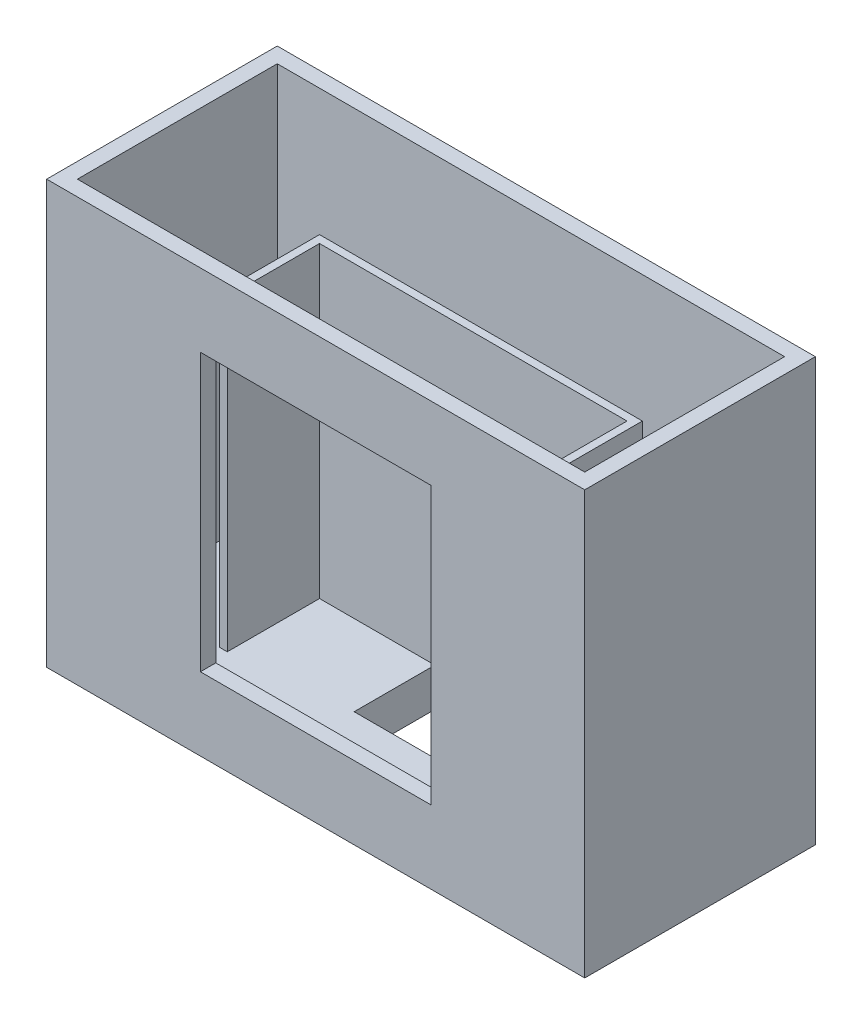
ISO-10303-21;
HEADER;
FILE_DESCRIPTION(('STEP AP214'),'2;1');
FILE_NAME('part.step','',(''),(''),'','','');
FILE_SCHEMA(('AUTOMOTIVE_DESIGN { 1 0 10303 214 1 1 1 1 }'));
ENDSEC;
DATA;
#1=APPLICATION_CONTEXT('core data for automotive mechanical design processes');
#2=APPLICATION_PROTOCOL_DEFINITION('international standard','automotive_design',2000,#1);
#3=PRODUCT_CONTEXT('',#1,'mechanical');
#4=PRODUCT('Part','Part','',(#3));
#5=PRODUCT_RELATED_PRODUCT_CATEGORY('part','',(#4));
#6=PRODUCT_DEFINITION_FORMATION('','',#4);
#7=PRODUCT_DEFINITION_CONTEXT('part definition',#1,'design');
#8=PRODUCT_DEFINITION('design','',#6,#7);
#9=PRODUCT_DEFINITION_SHAPE('','',#8);
#10=(LENGTH_UNIT() NAMED_UNIT(*) SI_UNIT(.MILLI.,.METRE.));
#11=(NAMED_UNIT(*) PLANE_ANGLE_UNIT() SI_UNIT($,.RADIAN.));
#12=(NAMED_UNIT(*) SI_UNIT($,.STERADIAN.) SOLID_ANGLE_UNIT());
#13=UNCERTAINTY_MEASURE_WITH_UNIT(LENGTH_MEASURE(1.E-05),#10,'distance_accuracy_value','');
#14=(GEOMETRIC_REPRESENTATION_CONTEXT(3) GLOBAL_UNCERTAINTY_ASSIGNED_CONTEXT((#13)) GLOBAL_UNIT_ASSIGNED_CONTEXT((#10,
#11,#12)) REPRESENTATION_CONTEXT('',''));
#15=CARTESIAN_POINT('',(0.,0.,0.));
#16=DIRECTION('',(0.,0.,1.));
#17=DIRECTION('',(1.,0.,0.));
#18=AXIS2_PLACEMENT_3D('',#15,#16,#17);
#19=CARTESIAN_POINT('',(0.,5.,0.));
#20=DIRECTION('',(0.,1.,0.));
#21=DIRECTION('',(0.,0.,1.));
#22=AXIS2_PLACEMENT_3D('',#19,#20,#21);
#23=PLANE('',#22);
#24=DIRECTION('',(0.,0.,-1.));
#25=VECTOR('',#24,1.);
#26=CARTESIAN_POINT('',(20.,5.,5.50000000000001));
#27=LINE('',#26,#25);
#28=CARTESIAN_POINT('',(20.,5.,6.5));
#29=VERTEX_POINT('',#28);
#30=CARTESIAN_POINT('',(20.,5.,-5.5));
#31=VERTEX_POINT('',#30);
#32=EDGE_CURVE('E274',#29,#31,#27,.T.);
#33=ORIENTED_EDGE('',*,*,#32,.T.);
#34=DIRECTION('',(-1.,0.,0.));
#35=VECTOR('',#34,1.);
#36=CARTESIAN_POINT('',(-20.,5.,-5.5));
#37=LINE('',#36,#35);
#38=CARTESIAN_POINT('',(-20.,5.,-5.5));
#39=VERTEX_POINT('',#38);
#40=EDGE_CURVE('E284',#31,#39,#37,.T.);
#41=ORIENTED_EDGE('',*,*,#40,.T.);
#42=DIRECTION('',(0.,0.,1.));
#43=VECTOR('',#42,1.);
#44=CARTESIAN_POINT('',(-20.,5.,5.50000000000001));
#45=LINE('',#44,#43);
#46=CARTESIAN_POINT('',(-20.,5.,6.5));
#47=VERTEX_POINT('',#46);
#48=EDGE_CURVE('E278',#39,#47,#45,.T.);
#49=ORIENTED_EDGE('',*,*,#48,.T.);
#50=DIRECTION('',(1.,0.,0.));
#51=VECTOR('',#50,1.);
#52=CARTESIAN_POINT('',(-21.,5.,6.5));
#53=LINE('',#52,#51);
#54=CARTESIAN_POINT('',(-21.,5.,6.5));
#55=VERTEX_POINT('',#54);
#56=EDGE_CURVE('E297',#55,#47,#53,.T.);
#57=ORIENTED_EDGE('',*,*,#56,.F.);
#58=DIRECTION('',(0.,0.,1.));
#59=VECTOR('',#58,1.);
#60=CARTESIAN_POINT('',(-21.,5.,6.5));
#61=LINE('',#60,#59);
#62=CARTESIAN_POINT('',(-21.,5.,-6.5));
#63=VERTEX_POINT('',#62);
#64=EDGE_CURVE('E310',#63,#55,#61,.T.);
#65=ORIENTED_EDGE('',*,*,#64,.F.);
#66=DIRECTION('',(-1.,0.,0.));
#67=VECTOR('',#66,1.);
#68=CARTESIAN_POINT('',(-21.,5.,-6.5));
#69=LINE('',#68,#67);
#70=CARTESIAN_POINT('',(21.,5.,-6.5));
#71=VERTEX_POINT('',#70);
#72=EDGE_CURVE('E308',#71,#63,#69,.T.);
#73=ORIENTED_EDGE('',*,*,#72,.F.);
#74=DIRECTION('',(0.,0.,-1.));
#75=VECTOR('',#74,1.);
#76=CARTESIAN_POINT('',(21.,5.,6.5));
#77=LINE('',#76,#75);
#78=CARTESIAN_POINT('',(21.,5.,6.5));
#79=VERTEX_POINT('',#78);
#80=EDGE_CURVE('E292',#79,#71,#77,.T.);
#81=ORIENTED_EDGE('',*,*,#80,.F.);
#82=EDGE_CURVE('E313',#29,#79,#53,.T.);
#83=ORIENTED_EDGE('',*,*,#82,.F.);
#84=EDGE_LOOP('',(#33,#41,#49,#57,#65,#73,#81,#83));
#85=FACE_BOUND('',#84,.T.);
#86=DIRECTION('',(-1.,0.,0.));
#87=VECTOR('',#86,1.);
#88=CARTESIAN_POINT('',(-35.,5.,13.));
#89=LINE('',#88,#87);
#90=CARTESIAN_POINT('',(33.,5.,13.));
#91=VERTEX_POINT('',#90);
#92=CARTESIAN_POINT('',(-33.,5.,13.));
#93=VERTEX_POINT('',#92);
#94=EDGE_CURVE('E350',#91,#93,#89,.T.);
#95=ORIENTED_EDGE('',*,*,#94,.F.);
#96=DIRECTION('',(0.,0.,1.));
#97=VECTOR('',#96,1.);
#98=CARTESIAN_POINT('',(33.,5.,-13.));
#99=LINE('',#98,#97);
#100=CARTESIAN_POINT('',(33.,5.,-13.));
#101=VERTEX_POINT('',#100);
#102=EDGE_CURVE('E331',#101,#91,#99,.T.);
#103=ORIENTED_EDGE('',*,*,#102,.F.);
#104=DIRECTION('',(1.,0.,0.));
#105=VECTOR('',#104,1.);
#106=CARTESIAN_POINT('',(-35.,5.,-13.));
#107=LINE('',#106,#105);
#108=CARTESIAN_POINT('',(-33.,5.,-13.));
#109=VERTEX_POINT('',#108);
#110=EDGE_CURVE('E347',#109,#101,#107,.T.);
#111=ORIENTED_EDGE('',*,*,#110,.F.);
#112=DIRECTION('',(0.,0.,-1.));
#113=VECTOR('',#112,1.);
#114=CARTESIAN_POINT('',(-33.,5.,-13.));
#115=LINE('',#114,#113);
#116=EDGE_CURVE('E333',#93,#109,#115,.T.);
#117=ORIENTED_EDGE('',*,*,#116,.F.);
#118=EDGE_LOOP('',(#95,#103,#111,#117));
#119=FACE_BOUND('',#118,.T.);
#120=DIRECTION('',(1.,0.,0.));
#121=VECTOR('',#120,1.);
#122=CARTESIAN_POINT('',(-5.,5.,-5.));
#123=LINE('',#122,#121);
#124=CARTESIAN_POINT('',(-5.,5.,-5.));
#125=VERTEX_POINT('',#124);
#126=CARTESIAN_POINT('',(5.,5.,-5.));
#127=VERTEX_POINT('',#126);
#128=EDGE_CURVE('E211',#125,#127,#123,.T.);
#129=ORIENTED_EDGE('',*,*,#128,.T.);
#130=DIRECTION('',(0.,0.,1.));
#131=VECTOR('',#130,1.);
#132=CARTESIAN_POINT('',(5.,5.,-5.));
#133=LINE('',#132,#131);
#134=CARTESIAN_POINT('',(5.,5.,5.));
#135=VERTEX_POINT('',#134);
#136=EDGE_CURVE('E205',#127,#135,#133,.T.);
#137=ORIENTED_EDGE('',*,*,#136,.T.);
#138=DIRECTION('',(-1.,0.,0.));
#139=VECTOR('',#138,1.);
#140=CARTESIAN_POINT('',(-5.,5.,5.));
#141=LINE('',#140,#139);
#142=CARTESIAN_POINT('',(-5.,5.,5.));
#143=VERTEX_POINT('',#142);
#144=EDGE_CURVE('E214',#135,#143,#141,.T.);
#145=ORIENTED_EDGE('',*,*,#144,.T.);
#146=DIRECTION('',(0.,0.,-1.));
#147=VECTOR('',#146,1.);
#148=CARTESIAN_POINT('',(-5.,5.,-5.));
#149=LINE('',#148,#147);
#150=EDGE_CURVE('E57',#143,#125,#149,.T.);
#151=ORIENTED_EDGE('',*,*,#150,.T.);
#152=EDGE_LOOP('',(#129,#137,#145,#151));
#153=FACE_BOUND('',#152,.T.);
#154=ADVANCED_FACE('F42',(#85,#119,#153),#23,.T.);
#155=CARTESIAN_POINT('',(-35.,55.,13.));
#156=DIRECTION('',(0.,0.,1.));
#157=DIRECTION('',(1.,0.,0.));
#158=AXIS2_PLACEMENT_3D('',#155,#156,#157);
#159=PLANE('',#158);
#160=DIRECTION('',(0.,-1.,0.));
#161=VECTOR('',#160,1.);
#162=CARTESIAN_POINT('',(33.,55.,13.));
#163=LINE('',#162,#161);
#164=CARTESIAN_POINT('',(33.,55.,13.));
#165=VERTEX_POINT('',#164);
#166=EDGE_CURVE('E327',#165,#91,#163,.T.);
#167=ORIENTED_EDGE('',*,*,#166,.T.);
#168=ORIENTED_EDGE('',*,*,#94,.T.);
#169=DIRECTION('',(0.,-1.,0.));
#170=VECTOR('',#169,1.);
#171=CARTESIAN_POINT('',(-33.,55.,13.));
#172=LINE('',#171,#170);
#173=CARTESIAN_POINT('',(-33.,55.,13.));
#174=VERTEX_POINT('',#173);
#175=EDGE_CURVE('E343',#174,#93,#172,.T.);
#176=ORIENTED_EDGE('',*,*,#175,.F.);
#177=DIRECTION('',(-1.,0.,0.));
#178=VECTOR('',#177,1.);
#179=CARTESIAN_POINT('',(-35.,55.,13.));
#180=LINE('',#179,#178);
#181=EDGE_CURVE('E364',#165,#174,#180,.T.);
#182=ORIENTED_EDGE('',*,*,#181,.F.);
#183=EDGE_LOOP('',(#167,#168,#176,#182));
#184=FACE_BOUND('',#183,.T.);
#185=DIRECTION('',(1.,0.,0.));
#186=VECTOR('',#185,1.);
#187=CARTESIAN_POINT('',(-35.,45.5,13.));
#188=LINE('',#187,#186);
#189=CARTESIAN_POINT('',(-15.,45.5,13.));
#190=VERTEX_POINT('',#189);
#191=CARTESIAN_POINT('',(15.,45.5,13.));
#192=VERTEX_POINT('',#191);
#193=EDGE_CURVE('E266',#190,#192,#188,.T.);
#194=ORIENTED_EDGE('',*,*,#193,.F.);
#195=DIRECTION('',(0.,1.,0.));
#196=VECTOR('',#195,1.);
#197=CARTESIAN_POINT('',(-15.,55.,13.));
#198=LINE('',#197,#196);
#199=CARTESIAN_POINT('',(-15.,9.50000000000001,13.));
#200=VERTEX_POINT('',#199);
#201=EDGE_CURVE('E252',#200,#190,#198,.T.);
#202=ORIENTED_EDGE('',*,*,#201,.F.);
#203=DIRECTION('',(1.,0.,0.));
#204=VECTOR('',#203,1.);
#205=CARTESIAN_POINT('',(-35.,9.5,13.));
#206=LINE('',#205,#204);
#207=CARTESIAN_POINT('',(15.,9.50000000000001,13.));
#208=VERTEX_POINT('',#207);
#209=EDGE_CURVE('E260',#200,#208,#206,.T.);
#210=ORIENTED_EDGE('',*,*,#209,.T.);
#211=DIRECTION('',(0.,1.,0.));
#212=VECTOR('',#211,1.);
#213=CARTESIAN_POINT('',(15.,55.,13.));
#214=LINE('',#213,#212);
#215=EDGE_CURVE('E263',#208,#192,#214,.T.);
#216=ORIENTED_EDGE('',*,*,#215,.T.);
#217=EDGE_LOOP('',(#194,#202,#210,#216));
#218=FACE_BOUND('',#217,.T.);
#219=ADVANCED_FACE('F411',(#184,#218),#159,.F.);
#220=CARTESIAN_POINT('',(-35.,5.,15.));
#221=DIRECTION('',(0.,0.,-1.));
#222=DIRECTION('',(-1.,0.,0.));
#223=AXIS2_PLACEMENT_3D('',#220,#221,#222);
#224=PLANE('',#223);
#225=DIRECTION('',(1.,0.,0.));
#226=VECTOR('',#225,1.);
#227=CARTESIAN_POINT('',(-35.,0.,15.));
#228=LINE('',#227,#226);
#229=CARTESIAN_POINT('',(-35.,0.,15.));
#230=VERTEX_POINT('',#229);
#231=CARTESIAN_POINT('',(35.,0.,15.));
#232=VERTEX_POINT('',#231);
#233=EDGE_CURVE('E374',#230,#232,#228,.T.);
#234=ORIENTED_EDGE('',*,*,#233,.T.);
#235=DIRECTION('',(0.,-1.,0.));
#236=VECTOR('',#235,1.);
#237=CARTESIAN_POINT('',(35.,5.,15.));
#238=LINE('',#237,#236);
#239=CARTESIAN_POINT('',(35.,55.,15.));
#240=VERTEX_POINT('',#239);
#241=EDGE_CURVE('E376',#240,#232,#238,.T.);
#242=ORIENTED_EDGE('',*,*,#241,.F.);
#243=DIRECTION('',(1.,0.,0.));
#244=VECTOR('',#243,1.);
#245=CARTESIAN_POINT('',(-35.,55.,15.));
#246=LINE('',#245,#244);
#247=CARTESIAN_POINT('',(-35.,55.,15.));
#248=VERTEX_POINT('',#247);
#249=EDGE_CURVE('E359',#248,#240,#246,.T.);
#250=ORIENTED_EDGE('',*,*,#249,.F.);
#251=DIRECTION('',(0.,-1.,0.));
#252=VECTOR('',#251,1.);
#253=CARTESIAN_POINT('',(-35.,5.,15.));
#254=LINE('',#253,#252);
#255=EDGE_CURVE('E379',#248,#230,#254,.T.);
#256=ORIENTED_EDGE('',*,*,#255,.T.);
#257=EDGE_LOOP('',(#234,#242,#250,#256));
#258=FACE_BOUND('',#257,.T.);
#259=DIRECTION('',(1.,0.,0.));
#260=VECTOR('',#259,1.);
#261=CARTESIAN_POINT('',(0.,45.5,15.));
#262=LINE('',#261,#260);
#263=CARTESIAN_POINT('',(-15.,45.5,15.));
#264=VERTEX_POINT('',#263);
#265=CARTESIAN_POINT('',(15.,45.5,15.));
#266=VERTEX_POINT('',#265);
#267=EDGE_CURVE('E234',#264,#266,#262,.T.);
#268=ORIENTED_EDGE('',*,*,#267,.T.);
#269=DIRECTION('',(0.,1.,0.));
#270=VECTOR('',#269,1.);
#271=CARTESIAN_POINT('',(15.,0.,15.));
#272=LINE('',#271,#270);
#273=CARTESIAN_POINT('',(15.,9.50000000000001,15.));
#274=VERTEX_POINT('',#273);
#275=EDGE_CURVE('E246',#274,#266,#272,.T.);
#276=ORIENTED_EDGE('',*,*,#275,.F.);
#277=DIRECTION('',(1.,0.,0.));
#278=VECTOR('',#277,1.);
#279=CARTESIAN_POINT('',(0.,9.50000000000001,15.));
#280=LINE('',#279,#278);
#281=CARTESIAN_POINT('',(-15.,9.50000000000001,15.));
#282=VERTEX_POINT('',#281);
#283=EDGE_CURVE('E243',#282,#274,#280,.T.);
#284=ORIENTED_EDGE('',*,*,#283,.F.);
#285=DIRECTION('',(0.,1.,0.));
#286=VECTOR('',#285,1.);
#287=CARTESIAN_POINT('',(-15.,0.,15.));
#288=LINE('',#287,#286);
#289=EDGE_CURVE('E240',#282,#264,#288,.T.);
#290=ORIENTED_EDGE('',*,*,#289,.T.);
#291=EDGE_LOOP('',(#268,#276,#284,#290));
#292=FACE_BOUND('',#291,.T.);
#293=ADVANCED_FACE('F393',(#258,#292),#224,.F.);
#294=CARTESIAN_POINT('',(-21.,45.,6.5));
#295=DIRECTION('',(0.,0.,-1.));
#296=DIRECTION('',(-1.,0.,0.));
#297=AXIS2_PLACEMENT_3D('',#294,#295,#296);
#298=PLANE('',#297);
#299=ORIENTED_EDGE('',*,*,#56,.T.);
#300=DIRECTION('',(0.,-1.,0.));
#301=VECTOR('',#300,1.);
#302=CARTESIAN_POINT('',(-20.,45.,6.5));
#303=LINE('',#302,#301);
#304=CARTESIAN_POINT('',(-20.,45.,6.5));
#305=VERTEX_POINT('',#304);
#306=EDGE_CURVE('E268',#305,#47,#303,.T.);
#307=ORIENTED_EDGE('',*,*,#306,.F.);
#308=DIRECTION('',(1.,0.,0.));
#309=VECTOR('',#308,1.);
#310=CARTESIAN_POINT('',(-21.,45.,6.5));
#311=LINE('',#310,#309);
#312=CARTESIAN_POINT('',(-21.,45.,6.5));
#313=VERTEX_POINT('',#312);
#314=EDGE_CURVE('E302',#313,#305,#311,.T.);
#315=ORIENTED_EDGE('',*,*,#314,.F.);
#316=DIRECTION('',(0.,-1.,0.));
#317=VECTOR('',#316,1.);
#318=CARTESIAN_POINT('',(-21.,45.,6.5));
#319=LINE('',#318,#317);
#320=EDGE_CURVE('E318',#313,#55,#319,.T.);
#321=ORIENTED_EDGE('',*,*,#320,.T.);
#322=EDGE_LOOP('',(#299,#307,#315,#321));
#323=FACE_BOUND('',#322,.T.);
#324=ADVANCED_FACE('F427',(#323),#298,.F.);
#325=CARTESIAN_POINT('',(-35.,55.,-13.));
#326=DIRECTION('',(0.,0.,-1.));
#327=DIRECTION('',(-1.,0.,0.));
#328=AXIS2_PLACEMENT_3D('',#325,#326,#327);
#329=PLANE('',#328);
#330=DIRECTION('',(0.,-1.,0.));
#331=VECTOR('',#330,1.);
#332=CARTESIAN_POINT('',(33.,55.,-13.));
#333=LINE('',#332,#331);
#334=CARTESIAN_POINT('',(33.,55.,-13.));
#335=VERTEX_POINT('',#334);
#336=EDGE_CURVE('E325',#335,#101,#333,.T.);
#337=ORIENTED_EDGE('',*,*,#336,.F.);
#338=DIRECTION('',(1.,0.,0.));
#339=VECTOR('',#338,1.);
#340=CARTESIAN_POINT('',(-35.,55.,-13.));
#341=LINE('',#340,#339);
#342=CARTESIAN_POINT('',(-33.,55.,-13.));
#343=VERTEX_POINT('',#342);
#344=EDGE_CURVE('E351',#343,#335,#341,.T.);
#345=ORIENTED_EDGE('',*,*,#344,.F.);
#346=DIRECTION('',(0.,-1.,0.));
#347=VECTOR('',#346,1.);
#348=CARTESIAN_POINT('',(-33.,55.,-13.));
#349=LINE('',#348,#347);
#350=EDGE_CURVE('E339',#343,#109,#349,.T.);
#351=ORIENTED_EDGE('',*,*,#350,.T.);
#352=ORIENTED_EDGE('',*,*,#110,.T.);
#353=EDGE_LOOP('',(#337,#345,#351,#352));
#354=FACE_BOUND('',#353,.T.);
#355=ADVANCED_FACE('F409',(#354),#329,.F.);
#356=CARTESIAN_POINT('',(35.,5.,-15.));
#357=DIRECTION('',(-1.,0.,0.));
#358=DIRECTION('',(0.,0.,1.));
#359=AXIS2_PLACEMENT_3D('',#356,#357,#358);
#360=PLANE('',#359);
#361=DIRECTION('',(0.,0.,-1.));
#362=VECTOR('',#361,1.);
#363=CARTESIAN_POINT('',(35.,0.,-15.));
#364=LINE('',#363,#362);
#365=CARTESIAN_POINT('',(35.,0.,-15.));
#366=VERTEX_POINT('',#365);
#367=EDGE_CURVE('E366',#232,#366,#364,.T.);
#368=ORIENTED_EDGE('',*,*,#367,.T.);
#369=DIRECTION('',(0.,-1.,0.));
#370=VECTOR('',#369,1.);
#371=CARTESIAN_POINT('',(35.,5.,-15.));
#372=LINE('',#371,#370);
#373=CARTESIAN_POINT('',(35.,55.,-15.));
#374=VERTEX_POINT('',#373);
#375=EDGE_CURVE('E11',#374,#366,#372,.T.);
#376=ORIENTED_EDGE('',*,*,#375,.F.);
#377=DIRECTION('',(0.,0.,-1.));
#378=VECTOR('',#377,1.);
#379=CARTESIAN_POINT('',(35.,55.,15.));
#380=LINE('',#379,#378);
#381=EDGE_CURVE('E362',#240,#374,#380,.T.);
#382=ORIENTED_EDGE('',*,*,#381,.F.);
#383=ORIENTED_EDGE('',*,*,#241,.T.);
#384=EDGE_LOOP('',(#368,#376,#382,#383));
#385=FACE_BOUND('',#384,.T.);
#386=ADVANCED_FACE('F44',(#385),#360,.F.);
#387=CARTESIAN_POINT('',(-35.,5.,-15.));
#388=DIRECTION('',(0.,0.,1.));
#389=DIRECTION('',(1.,0.,0.));
#390=AXIS2_PLACEMENT_3D('',#387,#388,#389);
#391=PLANE('',#390);
#392=DIRECTION('',(-1.,0.,0.));
#393=VECTOR('',#392,1.);
#394=CARTESIAN_POINT('',(-35.,0.,-15.));
#395=LINE('',#394,#393);
#396=CARTESIAN_POINT('',(-35.,0.,-15.));
#397=VERTEX_POINT('',#396);
#398=EDGE_CURVE('E370',#366,#397,#395,.T.);
#399=ORIENTED_EDGE('',*,*,#398,.T.);
#400=DIRECTION('',(0.,-1.,0.));
#401=VECTOR('',#400,1.);
#402=CARTESIAN_POINT('',(-35.,5.,-15.));
#403=LINE('',#402,#401);
#404=CARTESIAN_POINT('',(-35.,55.,-15.));
#405=VERTEX_POINT('',#404);
#406=EDGE_CURVE('E50',#405,#397,#403,.T.);
#407=ORIENTED_EDGE('',*,*,#406,.F.);
#408=DIRECTION('',(-1.,0.,0.));
#409=VECTOR('',#408,1.);
#410=CARTESIAN_POINT('',(-35.,55.,-15.));
#411=LINE('',#410,#409);
#412=EDGE_CURVE('E346',#374,#405,#411,.T.);
#413=ORIENTED_EDGE('',*,*,#412,.F.);
#414=ORIENTED_EDGE('',*,*,#375,.T.);
#415=EDGE_LOOP('',(#399,#407,#413,#414));
#416=FACE_BOUND('',#415,.T.);
#417=ADVANCED_FACE('F401',(#416),#391,.F.);
#418=CARTESIAN_POINT('',(-35.,5.,-15.));
#419=DIRECTION('',(1.,0.,0.));
#420=DIRECTION('',(0.,0.,-1.));
#421=AXIS2_PLACEMENT_3D('',#418,#419,#420);
#422=PLANE('',#421);
#423=DIRECTION('',(0.,0.,1.));
#424=VECTOR('',#423,1.);
#425=CARTESIAN_POINT('',(-35.,0.,-15.));
#426=LINE('',#425,#424);
#427=EDGE_CURVE('E372',#397,#230,#426,.T.);
#428=ORIENTED_EDGE('',*,*,#427,.T.);
#429=ORIENTED_EDGE('',*,*,#255,.F.);
#430=DIRECTION('',(0.,0.,1.));
#431=VECTOR('',#430,1.);
#432=CARTESIAN_POINT('',(-35.,55.,15.));
#433=LINE('',#432,#431);
#434=EDGE_CURVE('E356',#405,#248,#433,.T.);
#435=ORIENTED_EDGE('',*,*,#434,.F.);
#436=ORIENTED_EDGE('',*,*,#406,.T.);
#437=EDGE_LOOP('',(#428,#429,#435,#436));
#438=FACE_BOUND('',#437,.T.);
#439=ADVANCED_FACE('F385',(#438),#422,.F.);
#440=CARTESIAN_POINT('',(0.,0.,0.));
#441=DIRECTION('',(0.,1.,0.));
#442=DIRECTION('',(0.,0.,1.));
#443=AXIS2_PLACEMENT_3D('',#440,#441,#442);
#444=PLANE('',#443);
#445=DIRECTION('',(-1.,0.,0.));
#446=VECTOR('',#445,1.);
#447=CARTESIAN_POINT('',(-5.,0.,5.));
#448=LINE('',#447,#446);
#449=CARTESIAN_POINT('',(5.,0.,5.));
#450=VERTEX_POINT('',#449);
#451=CARTESIAN_POINT('',(-5.,0.,5.));
#452=VERTEX_POINT('',#451);
#453=EDGE_CURVE('E228',#450,#452,#448,.T.);
#454=ORIENTED_EDGE('',*,*,#453,.F.);
#455=DIRECTION('',(0.,0.,1.));
#456=VECTOR('',#455,1.);
#457=CARTESIAN_POINT('',(5.,0.,-5.));
#458=LINE('',#457,#456);
#459=CARTESIAN_POINT('',(5.,0.,-5.));
#460=VERTEX_POINT('',#459);
#461=EDGE_CURVE('E65',#460,#450,#458,.T.);
#462=ORIENTED_EDGE('',*,*,#461,.F.);
#463=DIRECTION('',(1.,0.,0.));
#464=VECTOR('',#463,1.);
#465=CARTESIAN_POINT('',(-5.,0.,-5.));
#466=LINE('',#465,#464);
#467=CARTESIAN_POINT('',(-5.,0.,-5.));
#468=VERTEX_POINT('',#467);
#469=EDGE_CURVE('E219',#468,#460,#466,.T.);
#470=ORIENTED_EDGE('',*,*,#469,.F.);
#471=DIRECTION('',(0.,0.,-1.));
#472=VECTOR('',#471,1.);
#473=CARTESIAN_POINT('',(-5.,0.,-5.));
#474=LINE('',#473,#472);
#475=EDGE_CURVE('E222',#452,#468,#474,.T.);
#476=ORIENTED_EDGE('',*,*,#475,.F.);
#477=EDGE_LOOP('',(#454,#462,#470,#476));
#478=FACE_BOUND('',#477,.T.);
#479=ORIENTED_EDGE('',*,*,#367,.F.);
#480=ORIENTED_EDGE('',*,*,#233,.F.);
#481=ORIENTED_EDGE('',*,*,#427,.F.);
#482=ORIENTED_EDGE('',*,*,#398,.F.);
#483=EDGE_LOOP('',(#479,#480,#481,#482));
#484=FACE_BOUND('',#483,.T.);
#485=ADVANCED_FACE('F391',(#478,#484),#444,.F.);
#486=CARTESIAN_POINT('',(0.,55.,0.));
#487=DIRECTION('',(0.,-1.,0.));
#488=DIRECTION('',(0.,0.,-1.));
#489=AXIS2_PLACEMENT_3D('',#486,#487,#488);
#490=PLANE('',#489);
#491=ORIENTED_EDGE('',*,*,#344,.T.);
#492=DIRECTION('',(0.,0.,1.));
#493=VECTOR('',#492,1.);
#494=CARTESIAN_POINT('',(33.,55.,-13.));
#495=LINE('',#494,#493);
#496=EDGE_CURVE('E330',#335,#165,#495,.T.);
#497=ORIENTED_EDGE('',*,*,#496,.T.);
#498=ORIENTED_EDGE('',*,*,#181,.T.);
#499=DIRECTION('',(0.,0.,-1.));
#500=VECTOR('',#499,1.);
#501=CARTESIAN_POINT('',(-33.,55.,-13.));
#502=LINE('',#501,#500);
#503=EDGE_CURVE('E336',#174,#343,#502,.T.);
#504=ORIENTED_EDGE('',*,*,#503,.T.);
#505=EDGE_LOOP('',(#491,#497,#498,#504));
#506=FACE_BOUND('',#505,.T.);
#507=ORIENTED_EDGE('',*,*,#434,.T.);
#508=ORIENTED_EDGE('',*,*,#249,.T.);
#509=ORIENTED_EDGE('',*,*,#381,.T.);
#510=ORIENTED_EDGE('',*,*,#412,.T.);
#511=EDGE_LOOP('',(#507,#508,#509,#510));
#512=FACE_BOUND('',#511,.T.);
#513=ADVANCED_FACE('F400',(#506,#512),#490,.F.);
#514=CARTESIAN_POINT('',(-33.,55.,-13.));
#515=DIRECTION('',(-1.,0.,0.));
#516=DIRECTION('',(0.,0.,1.));
#517=AXIS2_PLACEMENT_3D('',#514,#515,#516);
#518=PLANE('',#517);
#519=ORIENTED_EDGE('',*,*,#116,.T.);
#520=ORIENTED_EDGE('',*,*,#350,.F.);
#521=ORIENTED_EDGE('',*,*,#503,.F.);
#522=ORIENTED_EDGE('',*,*,#175,.T.);
#523=EDGE_LOOP('',(#519,#520,#521,#522));
#524=FACE_BOUND('',#523,.T.);
#525=ADVANCED_FACE('F495',(#524),#518,.F.);
#526=CARTESIAN_POINT('',(33.,55.,-13.));
#527=DIRECTION('',(1.,0.,0.));
#528=DIRECTION('',(0.,0.,-1.));
#529=AXIS2_PLACEMENT_3D('',#526,#527,#528);
#530=PLANE('',#529);
#531=ORIENTED_EDGE('',*,*,#102,.T.);
#532=ORIENTED_EDGE('',*,*,#166,.F.);
#533=ORIENTED_EDGE('',*,*,#496,.F.);
#534=ORIENTED_EDGE('',*,*,#336,.T.);
#535=EDGE_LOOP('',(#531,#532,#533,#534));
#536=FACE_BOUND('',#535,.T.);
#537=ADVANCED_FACE('F492',(#536),#530,.F.);
#538=CARTESIAN_POINT('',(0.,45.,0.));
#539=DIRECTION('',(0.,-1.,0.));
#540=DIRECTION('',(0.,0.,-1.));
#541=AXIS2_PLACEMENT_3D('',#538,#539,#540);
#542=PLANE('',#541);
#543=ORIENTED_EDGE('',*,*,#314,.T.);
#544=DIRECTION('',(0.,0.,1.));
#545=VECTOR('',#544,1.);
#546=CARTESIAN_POINT('',(-20.,45.,5.50000000000001));
#547=LINE('',#546,#545);
#548=CARTESIAN_POINT('',(-20.,45.,-5.5));
#549=VERTEX_POINT('',#548);
#550=EDGE_CURVE('E280',#549,#305,#547,.T.);
#551=ORIENTED_EDGE('',*,*,#550,.F.);
#552=DIRECTION('',(-1.,0.,0.));
#553=VECTOR('',#552,1.);
#554=CARTESIAN_POINT('',(-20.,45.,-5.5));
#555=LINE('',#554,#553);
#556=CARTESIAN_POINT('',(20.,45.,-5.5));
#557=VERTEX_POINT('',#556);
#558=EDGE_CURVE('E277',#557,#549,#555,.T.);
#559=ORIENTED_EDGE('',*,*,#558,.F.);
#560=DIRECTION('',(0.,0.,-1.));
#561=VECTOR('',#560,1.);
#562=CARTESIAN_POINT('',(20.,45.,5.50000000000001));
#563=LINE('',#562,#561);
#564=CARTESIAN_POINT('',(20.,45.,6.5));
#565=VERTEX_POINT('',#564);
#566=EDGE_CURVE('E275',#565,#557,#563,.T.);
#567=ORIENTED_EDGE('',*,*,#566,.F.);
#568=CARTESIAN_POINT('',(21.,45.,6.5));
#569=VERTEX_POINT('',#568);
#570=EDGE_CURVE('E301',#565,#569,#311,.T.);
#571=ORIENTED_EDGE('',*,*,#570,.T.);
#572=DIRECTION('',(0.,0.,-1.));
#573=VECTOR('',#572,1.);
#574=CARTESIAN_POINT('',(21.,45.,6.5));
#575=LINE('',#574,#573);
#576=CARTESIAN_POINT('',(21.,45.,-6.5));
#577=VERTEX_POINT('',#576);
#578=EDGE_CURVE('E293',#569,#577,#575,.T.);
#579=ORIENTED_EDGE('',*,*,#578,.T.);
#580=DIRECTION('',(-1.,0.,0.));
#581=VECTOR('',#580,1.);
#582=CARTESIAN_POINT('',(-21.,45.,-6.5));
#583=LINE('',#582,#581);
#584=CARTESIAN_POINT('',(-21.,45.,-6.5));
#585=VERTEX_POINT('',#584);
#586=EDGE_CURVE('E296',#577,#585,#583,.T.);
#587=ORIENTED_EDGE('',*,*,#586,.T.);
#588=DIRECTION('',(0.,0.,1.));
#589=VECTOR('',#588,1.);
#590=CARTESIAN_POINT('',(-21.,45.,6.5));
#591=LINE('',#590,#589);
#592=EDGE_CURVE('E299',#585,#313,#591,.T.);
#593=ORIENTED_EDGE('',*,*,#592,.T.);
#594=EDGE_LOOP('',(#543,#551,#559,#567,#571,#579,#587,#593));
#595=FACE_BOUND('',#594,.T.);
#596=ADVANCED_FACE('F462',(#595),#542,.F.);
#597=CARTESIAN_POINT('',(21.,45.,6.5));
#598=DIRECTION('',(-1.,0.,0.));
#599=DIRECTION('',(0.,0.,1.));
#600=AXIS2_PLACEMENT_3D('',#597,#598,#599);
#601=PLANE('',#600);
#602=ORIENTED_EDGE('',*,*,#80,.T.);
#603=DIRECTION('',(0.,-1.,0.));
#604=VECTOR('',#603,1.);
#605=CARTESIAN_POINT('',(21.,45.,-6.5));
#606=LINE('',#605,#604);
#607=EDGE_CURVE('E323',#577,#71,#606,.T.);
#608=ORIENTED_EDGE('',*,*,#607,.F.);
#609=ORIENTED_EDGE('',*,*,#578,.F.);
#610=DIRECTION('',(0.,-1.,0.));
#611=VECTOR('',#610,1.);
#612=CARTESIAN_POINT('',(21.,45.,6.5));
#613=LINE('',#612,#611);
#614=EDGE_CURVE('E305',#569,#79,#613,.T.);
#615=ORIENTED_EDGE('',*,*,#614,.T.);
#616=EDGE_LOOP('',(#602,#608,#609,#615));
#617=FACE_BOUND('',#616,.T.);
#618=ADVANCED_FACE('F484',(#617),#601,.F.);
#619=CARTESIAN_POINT('',(-21.,45.,-6.5));
#620=DIRECTION('',(0.,0.,1.));
#621=DIRECTION('',(1.,0.,0.));
#622=AXIS2_PLACEMENT_3D('',#619,#620,#621);
#623=PLANE('',#622);
#624=ORIENTED_EDGE('',*,*,#72,.T.);
#625=DIRECTION('',(0.,-1.,0.));
#626=VECTOR('',#625,1.);
#627=CARTESIAN_POINT('',(-21.,45.,-6.5));
#628=LINE('',#627,#626);
#629=EDGE_CURVE('E320',#585,#63,#628,.T.);
#630=ORIENTED_EDGE('',*,*,#629,.F.);
#631=ORIENTED_EDGE('',*,*,#586,.F.);
#632=ORIENTED_EDGE('',*,*,#607,.T.);
#633=EDGE_LOOP('',(#624,#630,#631,#632));
#634=FACE_BOUND('',#633,.T.);
#635=ADVANCED_FACE('F454',(#634),#623,.F.);
#636=CARTESIAN_POINT('',(-21.,45.,6.5));
#637=DIRECTION('',(1.,0.,0.));
#638=DIRECTION('',(0.,0.,-1.));
#639=AXIS2_PLACEMENT_3D('',#636,#637,#638);
#640=PLANE('',#639);
#641=ORIENTED_EDGE('',*,*,#64,.T.);
#642=ORIENTED_EDGE('',*,*,#320,.F.);
#643=ORIENTED_EDGE('',*,*,#592,.F.);
#644=ORIENTED_EDGE('',*,*,#629,.T.);
#645=EDGE_LOOP('',(#641,#642,#643,#644));
#646=FACE_BOUND('',#645,.T.);
#647=ADVANCED_FACE('F445',(#646),#640,.F.);
#648=ORIENTED_EDGE('',*,*,#570,.F.);
#649=DIRECTION('',(0.,1.,0.));
#650=VECTOR('',#649,1.);
#651=CARTESIAN_POINT('',(20.,45.,6.5));
#652=LINE('',#651,#650);
#653=EDGE_CURVE('E271',#29,#565,#652,.T.);
#654=ORIENTED_EDGE('',*,*,#653,.F.);
#655=ORIENTED_EDGE('',*,*,#82,.T.);
#656=ORIENTED_EDGE('',*,*,#614,.F.);
#657=EDGE_LOOP('',(#648,#654,#655,#656));
#658=FACE_BOUND('',#657,.T.);
#659=ADVANCED_FACE('F434',(#658),#298,.F.);
#660=CARTESIAN_POINT('',(20.,45.,5.50000000000001));
#661=DIRECTION('',(-1.,0.,0.));
#662=DIRECTION('',(0.,0.,1.));
#663=AXIS2_PLACEMENT_3D('',#660,#661,#662);
#664=PLANE('',#663);
#665=ORIENTED_EDGE('',*,*,#566,.T.);
#666=DIRECTION('',(0.,-1.,0.));
#667=VECTOR('',#666,1.);
#668=CARTESIAN_POINT('',(20.,45.,-5.5));
#669=LINE('',#668,#667);
#670=EDGE_CURVE('E289',#557,#31,#669,.T.);
#671=ORIENTED_EDGE('',*,*,#670,.T.);
#672=ORIENTED_EDGE('',*,*,#32,.F.);
#673=ORIENTED_EDGE('',*,*,#653,.T.);
#674=EDGE_LOOP('',(#665,#671,#672,#673));
#675=FACE_BOUND('',#674,.T.);
#676=ADVANCED_FACE('F444',(#675),#664,.T.);
#677=CARTESIAN_POINT('',(-20.,45.,-5.5));
#678=DIRECTION('',(0.,0.,1.));
#679=DIRECTION('',(1.,0.,0.));
#680=AXIS2_PLACEMENT_3D('',#677,#678,#679);
#681=PLANE('',#680);
#682=ORIENTED_EDGE('',*,*,#40,.F.);
#683=ORIENTED_EDGE('',*,*,#670,.F.);
#684=ORIENTED_EDGE('',*,*,#558,.T.);
#685=DIRECTION('',(0.,-1.,0.));
#686=VECTOR('',#685,1.);
#687=CARTESIAN_POINT('',(-20.,45.,-5.5));
#688=LINE('',#687,#686);
#689=EDGE_CURVE('E282',#549,#39,#688,.T.);
#690=ORIENTED_EDGE('',*,*,#689,.T.);
#691=EDGE_LOOP('',(#682,#683,#684,#690));
#692=FACE_BOUND('',#691,.T.);
#693=ADVANCED_FACE('F450',(#692),#681,.T.);
#694=CARTESIAN_POINT('',(-20.,45.,5.50000000000001));
#695=DIRECTION('',(1.,0.,0.));
#696=DIRECTION('',(0.,0.,-1.));
#697=AXIS2_PLACEMENT_3D('',#694,#695,#696);
#698=PLANE('',#697);
#699=ORIENTED_EDGE('',*,*,#306,.T.);
#700=ORIENTED_EDGE('',*,*,#48,.F.);
#701=ORIENTED_EDGE('',*,*,#689,.F.);
#702=ORIENTED_EDGE('',*,*,#550,.T.);
#703=EDGE_LOOP('',(#699,#700,#701,#702));
#704=FACE_BOUND('',#703,.T.);
#705=ADVANCED_FACE('F473',(#704),#698,.T.);
#706=CARTESIAN_POINT('',(0.,45.5,10.));
#707=DIRECTION('',(0.,-1.,0.));
#708=DIRECTION('',(0.,0.,-1.));
#709=AXIS2_PLACEMENT_3D('',#706,#707,#708);
#710=PLANE('',#709);
#711=ORIENTED_EDGE('',*,*,#193,.T.);
#712=DIRECTION('',(0.,0.,1.));
#713=VECTOR('',#712,1.);
#714=CARTESIAN_POINT('',(15.,45.5,10.));
#715=LINE('',#714,#713);
#716=EDGE_CURVE('E250',#192,#266,#715,.T.);
#717=ORIENTED_EDGE('',*,*,#716,.T.);
#718=ORIENTED_EDGE('',*,*,#267,.F.);
#719=DIRECTION('',(0.,0.,1.));
#720=VECTOR('',#719,1.);
#721=CARTESIAN_POINT('',(-15.,45.5,10.));
#722=LINE('',#721,#720);
#723=EDGE_CURVE('E249',#190,#264,#722,.T.);
#724=ORIENTED_EDGE('',*,*,#723,.F.);
#725=EDGE_LOOP('',(#711,#717,#718,#724));
#726=FACE_BOUND('',#725,.T.);
#727=ADVANCED_FACE('F518',(#726),#710,.T.);
#728=CARTESIAN_POINT('',(15.,0.,10.));
#729=DIRECTION('',(1.,0.,0.));
#730=DIRECTION('',(0.,0.,-1.));
#731=AXIS2_PLACEMENT_3D('',#728,#729,#730);
#732=PLANE('',#731);
#733=DIRECTION('',(0.,0.,1.));
#734=VECTOR('',#733,1.);
#735=CARTESIAN_POINT('',(15.,9.50000000000001,10.));
#736=LINE('',#735,#734);
#737=EDGE_CURVE('E253',#208,#274,#736,.T.);
#738=ORIENTED_EDGE('',*,*,#737,.T.);
#739=ORIENTED_EDGE('',*,*,#275,.T.);
#740=ORIENTED_EDGE('',*,*,#716,.F.);
#741=ORIENTED_EDGE('',*,*,#215,.F.);
#742=EDGE_LOOP('',(#738,#739,#740,#741));
#743=FACE_BOUND('',#742,.T.);
#744=ADVANCED_FACE('F520',(#743),#732,.F.);
#745=CARTESIAN_POINT('',(0.,9.50000000000001,10.));
#746=DIRECTION('',(0.,-1.,0.));
#747=DIRECTION('',(0.,0.,-1.));
#748=AXIS2_PLACEMENT_3D('',#745,#746,#747);
#749=PLANE('',#748);
#750=DIRECTION('',(0.,0.,1.));
#751=VECTOR('',#750,1.);
#752=CARTESIAN_POINT('',(-15.,9.50000000000001,10.));
#753=LINE('',#752,#751);
#754=EDGE_CURVE('E255',#200,#282,#753,.T.);
#755=ORIENTED_EDGE('',*,*,#754,.T.);
#756=ORIENTED_EDGE('',*,*,#283,.T.);
#757=ORIENTED_EDGE('',*,*,#737,.F.);
#758=ORIENTED_EDGE('',*,*,#209,.F.);
#759=EDGE_LOOP('',(#755,#756,#757,#758));
#760=FACE_BOUND('',#759,.T.);
#761=ADVANCED_FACE('F529',(#760),#749,.F.);
#762=CARTESIAN_POINT('',(-15.,0.,10.));
#763=DIRECTION('',(1.,0.,0.));
#764=DIRECTION('',(0.,0.,-1.));
#765=AXIS2_PLACEMENT_3D('',#762,#763,#764);
#766=PLANE('',#765);
#767=ORIENTED_EDGE('',*,*,#201,.T.);
#768=ORIENTED_EDGE('',*,*,#723,.T.);
#769=ORIENTED_EDGE('',*,*,#289,.F.);
#770=ORIENTED_EDGE('',*,*,#754,.F.);
#771=EDGE_LOOP('',(#767,#768,#769,#770));
#772=FACE_BOUND('',#771,.T.);
#773=ADVANCED_FACE('F526',(#772),#766,.T.);
#774=CARTESIAN_POINT('',(5.,5.,-5.));
#775=DIRECTION('',(1.,0.,0.));
#776=DIRECTION('',(0.,0.,-1.));
#777=AXIS2_PLACEMENT_3D('',#774,#775,#776);
#778=PLANE('',#777);
#779=ORIENTED_EDGE('',*,*,#461,.T.);
#780=DIRECTION('',(0.,-1.,0.));
#781=VECTOR('',#780,1.);
#782=CARTESIAN_POINT('',(5.,5.,5.));
#783=LINE('',#782,#781);
#784=EDGE_CURVE('E201',#135,#450,#783,.T.);
#785=ORIENTED_EDGE('',*,*,#784,.F.);
#786=ORIENTED_EDGE('',*,*,#136,.F.);
#787=DIRECTION('',(0.,-1.,0.));
#788=VECTOR('',#787,1.);
#789=CARTESIAN_POINT('',(5.,5.,-5.));
#790=LINE('',#789,#788);
#791=EDGE_CURVE('E232',#127,#460,#790,.T.);
#792=ORIENTED_EDGE('',*,*,#791,.T.);
#793=EDGE_LOOP('',(#779,#785,#786,#792));
#794=FACE_BOUND('',#793,.T.);
#795=ADVANCED_FACE('F203',(#794),#778,.F.);
#796=CARTESIAN_POINT('',(-5.,5.,-5.));
#797=DIRECTION('',(0.,0.,-1.));
#798=DIRECTION('',(-1.,0.,0.));
#799=AXIS2_PLACEMENT_3D('',#796,#797,#798);
#800=PLANE('',#799);
#801=ORIENTED_EDGE('',*,*,#469,.T.);
#802=ORIENTED_EDGE('',*,*,#791,.F.);
#803=ORIENTED_EDGE('',*,*,#128,.F.);
#804=DIRECTION('',(0.,-1.,0.));
#805=VECTOR('',#804,1.);
#806=CARTESIAN_POINT('',(-5.,5.,-5.));
#807=LINE('',#806,#805);
#808=EDGE_CURVE('E235',#125,#468,#807,.T.);
#809=ORIENTED_EDGE('',*,*,#808,.T.);
#810=EDGE_LOOP('',(#801,#802,#803,#809));
#811=FACE_BOUND('',#810,.T.);
#812=ADVANCED_FACE('F648',(#811),#800,.F.);
#813=CARTESIAN_POINT('',(-5.,5.,-5.));
#814=DIRECTION('',(-1.,0.,0.));
#815=DIRECTION('',(0.,0.,1.));
#816=AXIS2_PLACEMENT_3D('',#813,#814,#815);
#817=PLANE('',#816);
#818=ORIENTED_EDGE('',*,*,#475,.T.);
#819=ORIENTED_EDGE('',*,*,#808,.F.);
#820=ORIENTED_EDGE('',*,*,#150,.F.);
#821=DIRECTION('',(0.,-1.,0.));
#822=VECTOR('',#821,1.);
#823=CARTESIAN_POINT('',(-5.,5.,5.));
#824=LINE('',#823,#822);
#825=EDGE_CURVE('E210',#143,#452,#824,.T.);
#826=ORIENTED_EDGE('',*,*,#825,.T.);
#827=EDGE_LOOP('',(#818,#819,#820,#826));
#828=FACE_BOUND('',#827,.T.);
#829=ADVANCED_FACE('F656',(#828),#817,.F.);
#830=CARTESIAN_POINT('',(-5.,5.,5.));
#831=DIRECTION('',(0.,0.,1.));
#832=DIRECTION('',(1.,0.,0.));
#833=AXIS2_PLACEMENT_3D('',#830,#831,#832);
#834=PLANE('',#833);
#835=ORIENTED_EDGE('',*,*,#453,.T.);
#836=ORIENTED_EDGE('',*,*,#825,.F.);
#837=ORIENTED_EDGE('',*,*,#144,.F.);
#838=ORIENTED_EDGE('',*,*,#784,.T.);
#839=EDGE_LOOP('',(#835,#836,#837,#838));
#840=FACE_BOUND('',#839,.T.);
#841=ADVANCED_FACE('F215',(#840),#834,.F.);
#842=CLOSED_SHELL('',(#154,#219,#293,#324,#355,#386,#417,#439,#485,#513,#525,#537,#596,#618,
#635,#647,#659,#676,#693,#705,#727,#744,#761,#773,#795,#812,#829,#841));
#843=MANIFOLD_SOLID_BREP('B2',#842);
#844=ADVANCED_BREP_SHAPE_REPRESENTATION('',(#18,#843),#14);
#845=SHAPE_DEFINITION_REPRESENTATION(#9,#844);
ENDSEC;
END-ISO-10303-21;
